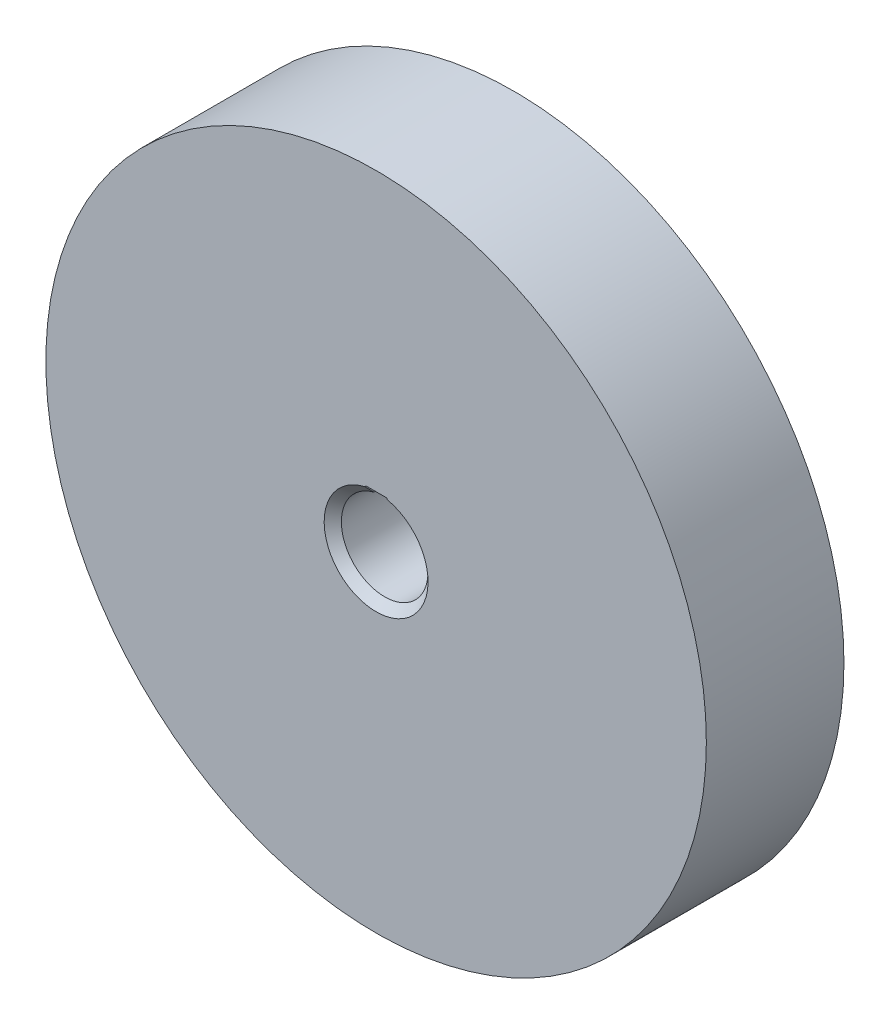
ISO-10303-21;
HEADER;
FILE_DESCRIPTION(('STEP AP214'),'2;1');
FILE_NAME('part.step','',(''),(''),'','','');
FILE_SCHEMA(('AUTOMOTIVE_DESIGN { 1 0 10303 214 1 1 1 1 }'));
ENDSEC;
DATA;
#1=APPLICATION_CONTEXT('core data for automotive mechanical design processes');
#2=APPLICATION_PROTOCOL_DEFINITION('international standard','automotive_design',2000,#1);
#3=PRODUCT_CONTEXT('',#1,'mechanical');
#4=PRODUCT('Part','Part','',(#3));
#5=PRODUCT_RELATED_PRODUCT_CATEGORY('part','',(#4));
#6=PRODUCT_DEFINITION_FORMATION('','',#4);
#7=PRODUCT_DEFINITION_CONTEXT('part definition',#1,'design');
#8=PRODUCT_DEFINITION('design','',#6,#7);
#9=PRODUCT_DEFINITION_SHAPE('','',#8);
#10=(LENGTH_UNIT() NAMED_UNIT(*) SI_UNIT(.MILLI.,.METRE.));
#11=(NAMED_UNIT(*) PLANE_ANGLE_UNIT() SI_UNIT($,.RADIAN.));
#12=(NAMED_UNIT(*) SI_UNIT($,.STERADIAN.) SOLID_ANGLE_UNIT());
#13=UNCERTAINTY_MEASURE_WITH_UNIT(LENGTH_MEASURE(1.E-05),#10,'distance_accuracy_value','');
#14=(GEOMETRIC_REPRESENTATION_CONTEXT(3) GLOBAL_UNCERTAINTY_ASSIGNED_CONTEXT((#13)) GLOBAL_UNIT_ASSIGNED_CONTEXT((#10,
#11,#12)) REPRESENTATION_CONTEXT('',''));
#15=CARTESIAN_POINT('',(0.,0.,0.));
#16=DIRECTION('',(0.,0.,1.));
#17=DIRECTION('',(1.,0.,0.));
#18=AXIS2_PLACEMENT_3D('',#15,#16,#17);
#19=CARTESIAN_POINT('',(0.,0.,6.35));
#20=DIRECTION('',(0.,0.,1.));
#21=DIRECTION('',(1.,0.,0.));
#22=AXIS2_PLACEMENT_3D('',#19,#20,#21);
#23=PLANE('',#22);
#24=DIRECTION('',(0.,-1.,0.));
#25=VECTOR('',#24,1.);
#26=CARTESIAN_POINT('',(-1.,4.8,6.35));
#27=LINE('',#26,#25);
#28=CARTESIAN_POINT('',(-1.,4.8,6.35));
#29=VERTEX_POINT('',#28);
#30=CARTESIAN_POINT('',(-1.,4.68828743386108,6.35));
#31=VERTEX_POINT('',#30);
#32=EDGE_CURVE('E130',#29,#31,#27,.T.);
#33=ORIENTED_EDGE('',*,*,#32,.F.);
#34=DIRECTION('',(1.,0.,0.));
#35=VECTOR('',#34,1.);
#36=CARTESIAN_POINT('',(-1.,4.8,6.35));
#37=LINE('',#36,#35);
#38=CARTESIAN_POINT('',(1.,4.8,6.35));
#39=VERTEX_POINT('',#38);
#40=EDGE_CURVE('E127',#29,#39,#37,.T.);
#41=ORIENTED_EDGE('',*,*,#40,.T.);
#42=DIRECTION('',(0.,-1.,0.));
#43=VECTOR('',#42,1.);
#44=CARTESIAN_POINT('',(1.,4.8,6.35));
#45=LINE('',#44,#43);
#46=CARTESIAN_POINT('',(1.,4.68828743386108,6.35));
#47=VERTEX_POINT('',#46);
#48=EDGE_CURVE('E114',#39,#47,#45,.T.);
#49=ORIENTED_EDGE('',*,*,#48,.T.);
#50=CARTESIAN_POINT('',(0.,0.,6.35));
#51=DIRECTION('',(0.,0.,1.));
#52=DIRECTION('',(1.,0.,0.));
#53=AXIS2_PLACEMENT_3D('',#50,#51,#52);
#54=CIRCLE('',#53,4.79374999999997);
#55=EDGE_CURVE('E166',#47,#31,#54,.F.);
#56=ORIENTED_EDGE('',*,*,#55,.T.);
#57=EDGE_LOOP('',(#33,#41,#49,#56));
#58=FACE_BOUND('',#57,.T.);
#59=CARTESIAN_POINT('',(0.,0.,6.35));
#60=DIRECTION('',(0.,0.,1.));
#61=DIRECTION('',(1.,0.,0.));
#62=AXIS2_PLACEMENT_3D('',#59,#60,#61);
#63=CIRCLE('',#62,30.48);
#64=CARTESIAN_POINT('',(30.48,0.,6.35));
#65=VERTEX_POINT('',#64);
#66=EDGE_CURVE('E180',#65,#65,#63,.T.);
#67=ORIENTED_EDGE('',*,*,#66,.T.);
#68=EDGE_LOOP('',(#67));
#69=FACE_BOUND('',#68,.T.);
#70=ADVANCED_FACE('F39',(#58,#69),#23,.T.);
#71=CARTESIAN_POINT('',(0.,0.,-6.35));
#72=DIRECTION('',(0.,0.,1.));
#73=DIRECTION('',(1.,0.,0.));
#74=AXIS2_PLACEMENT_3D('',#71,#72,#73);
#75=PLANE('',#74);
#76=DIRECTION('',(1.,0.,0.));
#77=VECTOR('',#76,1.);
#78=CARTESIAN_POINT('',(-1.,4.8,-6.35));
#79=LINE('',#78,#77);
#80=CARTESIAN_POINT('',(-1.,4.8,-6.35));
#81=VERTEX_POINT('',#80);
#82=CARTESIAN_POINT('',(1.,4.8,-6.35));
#83=VERTEX_POINT('',#82);
#84=EDGE_CURVE('E97',#81,#83,#79,.T.);
#85=ORIENTED_EDGE('',*,*,#84,.F.);
#86=DIRECTION('',(0.,-1.,0.));
#87=VECTOR('',#86,1.);
#88=CARTESIAN_POINT('',(-1.,4.8,-6.35));
#89=LINE('',#88,#87);
#90=CARTESIAN_POINT('',(-1.,4.6882874338611,-6.35));
#91=VERTEX_POINT('',#90);
#92=EDGE_CURVE('E124',#81,#91,#89,.T.);
#93=ORIENTED_EDGE('',*,*,#92,.T.);
#94=CARTESIAN_POINT('',(0.,0.,-6.35));
#95=DIRECTION('',(0.,0.,1.));
#96=DIRECTION('',(1.,0.,0.));
#97=AXIS2_PLACEMENT_3D('',#94,#95,#96);
#98=CIRCLE('',#97,4.79374999999999);
#99=CARTESIAN_POINT('',(1.,4.6882874338611,-6.35));
#100=VERTEX_POINT('',#99);
#101=EDGE_CURVE('E122',#91,#100,#98,.T.);
#102=ORIENTED_EDGE('',*,*,#101,.T.);
#103=DIRECTION('',(0.,-1.,0.));
#104=VECTOR('',#103,1.);
#105=CARTESIAN_POINT('',(1.,4.8,-6.35));
#106=LINE('',#105,#104);
#107=EDGE_CURVE('E109',#83,#100,#106,.T.);
#108=ORIENTED_EDGE('',*,*,#107,.F.);
#109=EDGE_LOOP('',(#85,#93,#102,#108));
#110=FACE_BOUND('',#109,.T.);
#111=CARTESIAN_POINT('',(0.,0.,-6.35));
#112=DIRECTION('',(0.,0.,1.));
#113=DIRECTION('',(1.,0.,0.));
#114=AXIS2_PLACEMENT_3D('',#111,#112,#113);
#115=CIRCLE('',#114,30.48);
#116=CARTESIAN_POINT('',(30.48,0.,-6.35));
#117=VERTEX_POINT('',#116);
#118=EDGE_CURVE('E181',#117,#117,#115,.T.);
#119=ORIENTED_EDGE('',*,*,#118,.F.);
#120=EDGE_LOOP('',(#119));
#121=FACE_BOUND('',#120,.T.);
#122=ADVANCED_FACE('F119',(#110,#121),#75,.F.);
#123=CARTESIAN_POINT('',(0.,0.,6.35));
#124=DIRECTION('',(0.,0.,-1.));
#125=DIRECTION('',(-1.,0.,0.));
#126=AXIS2_PLACEMENT_3D('',#123,#124,#125);
#127=CYLINDRICAL_SURFACE('',#126,30.48);
#128=ORIENTED_EDGE('',*,*,#66,.F.);
#129=EDGE_LOOP('',(#128));
#130=FACE_BOUND('',#129,.T.);
#131=ORIENTED_EDGE('',*,*,#118,.T.);
#132=EDGE_LOOP('',(#131));
#133=FACE_BOUND('',#132,.T.);
#134=ADVANCED_FACE('F209',(#130,#133),#127,.T.);
#135=CARTESIAN_POINT('',(0.,0.,6.35));
#136=DIRECTION('',(0.,0.,-1.));
#137=DIRECTION('',(-1.,0.,0.));
#138=AXIS2_PLACEMENT_3D('',#135,#136,#137);
#139=CYLINDRICAL_SURFACE('',#138,4.);
#140=DIRECTION('',(0.,0.,-1.));
#141=VECTOR('',#140,1.);
#142=CARTESIAN_POINT('',(-1.,3.87298334620742,6.35));
#143=LINE('',#142,#141);
#144=CARTESIAN_POINT('',(-1.,3.87298334620742,5.55625000000003));
#145=VERTEX_POINT('',#144);
#146=CARTESIAN_POINT('',(-1.,3.87298334620742,-5.55625000000001));
#147=VERTEX_POINT('',#146);
#148=EDGE_CURVE('E68',#145,#147,#143,.T.);
#149=ORIENTED_EDGE('',*,*,#148,.F.);
#150=CARTESIAN_POINT('',(0.,0.,5.55625000000003));
#151=DIRECTION('',(0.,0.,1.));
#152=DIRECTION('',(1.,0.,0.));
#153=AXIS2_PLACEMENT_3D('',#150,#151,#152);
#154=CIRCLE('',#153,4.);
#155=CARTESIAN_POINT('',(1.,3.87298334620742,5.55625000000003));
#156=VERTEX_POINT('',#155);
#157=EDGE_CURVE('E174',#145,#156,#154,.T.);
#158=ORIENTED_EDGE('',*,*,#157,.T.);
#159=DIRECTION('',(0.,0.,-1.));
#160=VECTOR('',#159,1.);
#161=CARTESIAN_POINT('',(1.,3.87298334620742,6.35));
#162=LINE('',#161,#160);
#163=CARTESIAN_POINT('',(1.,3.87298334620742,-5.55625000000001));
#164=VERTEX_POINT('',#163);
#165=EDGE_CURVE('E61',#156,#164,#162,.T.);
#166=ORIENTED_EDGE('',*,*,#165,.T.);
#167=CARTESIAN_POINT('',(0.,0.,-5.55625000000001));
#168=DIRECTION('',(0.,0.,1.));
#169=DIRECTION('',(1.,0.,0.));
#170=AXIS2_PLACEMENT_3D('',#167,#168,#169);
#171=CIRCLE('',#170,4.);
#172=EDGE_CURVE('E170',#164,#147,#171,.F.);
#173=ORIENTED_EDGE('',*,*,#172,.T.);
#174=EDGE_LOOP('',(#149,#158,#166,#173));
#175=FACE_BOUND('',#174,.T.);
#176=ADVANCED_FACE('F197',(#175),#139,.F.);
#177=CARTESIAN_POINT('',(0.,0.,-6.35));
#178=DIRECTION('',(0.,0.,-1.));
#179=DIRECTION('',(-1.,0.,0.));
#180=AXIS2_PLACEMENT_3D('',#177,#178,#179);
#181=CONICAL_SURFACE('',#180,4.79374999999999,0.785398163397447);
#182=CARTESIAN_POINT('',(-1.,1.56101887611727,-3.41010542359549));
#183=CARTESIAN_POINT('',(-1.,1.63031560156577,-3.46849195876424));
#184=CARTESIAN_POINT('',(-1.,1.69908713550226,-3.52749312653382));
#185=CARTESIAN_POINT('',(-1.,1.83578876307598,-3.64645336681735));
#186=CARTESIAN_POINT('',(-1.,1.90371891879933,-3.7064123678952));
#187=CARTESIAN_POINT('',(-1.,2.03894408112881,-3.82701417824535));
#188=CARTESIAN_POINT('',(-1.,2.10623920622223,-3.8876568551266));
#189=CARTESIAN_POINT('',(-1.,2.2403416594233,-4.00948160781827));
#190=CARTESIAN_POINT('',(-1.,2.30714897702576,-4.07066369518291));
#191=CARTESIAN_POINT('',(-1.,2.50696518711951,-4.25480177327277));
#192=CARTESIAN_POINT('',(-1.,2.63940113058987,-4.37837905441009));
#193=CARTESIAN_POINT('',(-1.,2.90328075027672,-4.6266011045816));
#194=CARTESIAN_POINT('',(-1.,3.03472436503242,-4.75124593873154));
#195=CARTESIAN_POINT('',(-1.,3.32191556784926,-5.02509769995364));
#196=CARTESIAN_POINT('',(-1.,3.477518427985,-5.17445629884279));
#197=CARTESIAN_POINT('',(-1.,3.78805778455673,-5.47386467170966));
#198=CARTESIAN_POINT('',(-1.,3.94299427863718,-5.62391444812677));
#199=CARTESIAN_POINT('',(-1.,4.4071014067997,-6.07477667561111));
#200=CARTESIAN_POINT('',(-1.,4.71557456865609,-6.37630670909211));
#201=CARTESIAN_POINT('',(-1.,5.33163911313389,-6.98053333031648));
#202=CARTESIAN_POINT('',(-1.,5.63923005052873,-7.28323037102958));
#203=CARTESIAN_POINT('',(-1.,6.10013731317609,-7.73775742388931));
#204=CARTESIAN_POINT('',(-1.,6.2536921460108,-7.88934563631695));
#205=CARTESIAN_POINT('',(-1.,6.56067138224563,-8.19265368456171));
#206=CARTESIAN_POINT('',(-1.,6.71409578581253,-8.34437352021003));
#207=CARTESIAN_POINT('',(-1.,6.86746945618316,-8.49614457640452));
#208=B_SPLINE_CURVE_WITH_KNOTS('',3,(#182,#183,#184,#185,#186,#187,#188,#189,#190,#191,#192,
#193,#194,#195,#196,#197,#198,#199,#200,#201,#202,#203,#204,#205,#206,#207),.UNSPECIFIED.,.F.,
.F.,(4,2,2,2,2,2,2,2,2,2,2,2,4),(0.,0.271832465037672,0.543644750339066,0.815405274769707,
1.0871716345484,1.63057208710798,2.17400592401157,2.82105897339018,3.46811430817453,
4.76220468121841,6.05686167325361,6.70418118342151,7.35149986470206),.UNSPECIFIED.);
#209=EDGE_CURVE('E185',#147,#91,#208,.T.);
#210=ORIENTED_EDGE('',*,*,#209,.F.);
#211=ORIENTED_EDGE('',*,*,#172,.F.);
#212=CARTESIAN_POINT('',(1.,1.56101887611726,-3.41010542359549));
#213=CARTESIAN_POINT('',(1.,1.63031560156577,-3.46849195876424));
#214=CARTESIAN_POINT('',(1.,1.69908713550225,-3.52749312653381));
#215=CARTESIAN_POINT('',(1.,1.83578876307598,-3.64645336681735));
#216=CARTESIAN_POINT('',(1.,1.90371891879932,-3.7064123678952));
#217=CARTESIAN_POINT('',(1.,2.03894408112881,-3.82701417824534));
#218=CARTESIAN_POINT('',(1.,2.10623920622223,-3.8876568551266));
#219=CARTESIAN_POINT('',(1.,2.2403416594233,-4.00948160781827));
#220=CARTESIAN_POINT('',(1.,2.30714897702575,-4.07066369518291));
#221=CARTESIAN_POINT('',(1.,2.5069651871195,-4.25480177327277));
#222=CARTESIAN_POINT('',(1.,2.63940113058986,-4.37837905441009));
#223=CARTESIAN_POINT('',(1.,2.90328075027671,-4.62660110458159));
#224=CARTESIAN_POINT('',(1.,3.03472436503241,-4.75124593873153));
#225=CARTESIAN_POINT('',(1.,3.32191556784925,-5.02509769995364));
#226=CARTESIAN_POINT('',(1.,3.47751842798499,-5.17445629884279));
#227=CARTESIAN_POINT('',(1.,3.78805778455673,-5.47386467170966));
#228=CARTESIAN_POINT('',(1.,3.94299427863717,-5.62391444812676));
#229=CARTESIAN_POINT('',(1.,4.40710140679969,-6.07477667561111));
#230=CARTESIAN_POINT('',(1.,4.71557456865608,-6.37630670909211));
#231=CARTESIAN_POINT('',(1.,5.33163911313389,-6.98053333031647));
#232=CARTESIAN_POINT('',(1.,5.63923005052872,-7.28323037102957));
#233=CARTESIAN_POINT('',(1.,6.10013731317609,-7.73775742388931));
#234=CARTESIAN_POINT('',(1.,6.25369214601079,-7.88934563631695));
#235=CARTESIAN_POINT('',(1.,6.56067138224563,-8.1926536845617));
#236=CARTESIAN_POINT('',(1.,6.71409578581253,-8.34437352021003));
#237=CARTESIAN_POINT('',(1.,6.86746945618316,-8.49614457640451));
#238=B_SPLINE_CURVE_WITH_KNOTS('',3,(#212,#213,#214,#215,#216,#217,#218,#219,#220,#221,#222,
#223,#224,#225,#226,#227,#228,#229,#230,#231,#232,#233,#234,#235,#236,#237),.UNSPECIFIED.,.F.,
.F.,(4,2,2,2,2,2,2,2,2,2,2,2,4),(0.,0.271832465037672,0.543644750339065,0.815405274769705,
1.0871716345484,1.63057208710798,2.17400592401157,2.82105897339018,3.46811430817453,
4.76220468121841,6.05686167325361,6.70418118342151,7.35149986470206),.UNSPECIFIED.);
#239=EDGE_CURVE('E141',#164,#100,#238,.T.);
#240=ORIENTED_EDGE('',*,*,#239,.T.);
#241=ORIENTED_EDGE('',*,*,#101,.F.);
#242=EDGE_LOOP('',(#210,#211,#240,#241));
#243=FACE_BOUND('',#242,.T.);
#244=ADVANCED_FACE('F150',(#243),#181,.F.);
#245=CARTESIAN_POINT('',(0.,0.,5.55625000000003));
#246=DIRECTION('',(0.,0.,1.));
#247=DIRECTION('',(1.,0.,0.));
#248=AXIS2_PLACEMENT_3D('',#245,#246,#247);
#249=CONICAL_SURFACE('',#248,4.,0.785398163397449);
#250=CARTESIAN_POINT('',(-1.,6.86746945618312,8.49614457640449));
#251=CARTESIAN_POINT('',(-1.,6.64975244621646,8.28071267299576));
#252=CARTESIAN_POINT('',(-1.,6.43194127718374,8.06537568246426));
#253=CARTESIAN_POINT('',(-1.,5.99603628756988,7.63500048278696));
#254=CARTESIAN_POINT('',(-1.,5.77794247524007,7.41996226528251));
#255=CARTESIAN_POINT('',(-1.,5.34140204805733,6.99031727878304));
#256=CARTESIAN_POINT('',(-1.,5.12295549850609,6.77571044347901));
#257=CARTESIAN_POINT('',(-1.,4.68549164636261,6.34706604570659));
#258=CARTESIAN_POINT('',(-1.,4.46647432694782,6.13302850040157));
#259=CARTESIAN_POINT('',(-1.,4.0275330027154,5.7057628364912));
#260=CARTESIAN_POINT('',(-1.,3.8076087658783,5.4925349557739));
#261=CARTESIAN_POINT('',(-1.,3.47669130053288,5.17377971066678));
#262=CARTESIAN_POINT('',(-1.,3.36621778863858,5.06771301493094));
#263=CARTESIAN_POINT('',(-1.,3.14480722777125,4.85606049036194));
#264=CARTESIAN_POINT('',(-1.,3.03387017142385,4.75047466923513));
#265=CARTESIAN_POINT('',(-1.,2.81134377523253,4.53993161704434));
#266=CARTESIAN_POINT('',(-1.,2.69975426700958,4.43497456380183));
#267=CARTESIAN_POINT('',(-1.,2.47571380933687,4.22599097209078));
#268=CARTESIAN_POINT('',(-1.,2.36326289805644,4.12196439283005));
#269=CARTESIAN_POINT('',(-1.,2.19362358732451,3.96694753618617));
#270=CARTESIAN_POINT('',(-1.,2.13690903032435,3.91543895017816));
#271=CARTESIAN_POINT('',(-1.,2.02308838260687,3.81285767396039));
#272=CARTESIAN_POINT('',(-1.,1.96598229814353,3.76178497681718));
#273=CARTESIAN_POINT('',(-1.,1.85127695419597,3.6601776576263));
#274=CARTESIAN_POINT('',(-1.,1.79367762249879,3.60964311688301));
#275=CARTESIAN_POINT('',(-1.,1.67785223852049,3.50929165435925));
#276=CARTESIAN_POINT('',(-1.,1.61962615189333,3.45947477225975));
#277=CARTESIAN_POINT('',(-1.,1.56101887611729,3.41010542359554));
#278=B_SPLINE_CURVE_WITH_KNOTS('',3,(#250,#251,#252,#253,#254,#255,#256,#257,#258,#259,#260,
#261,#262,#263,#264,#265,#266,#267,#268,#269,#270,#271,#272,#273,#274,#275,#276,#277),
.UNSPECIFIED.,.F.,.F.,(4,2,2,2,2,2,2,2,2,2,2,2,2,4),(0.,0.918860610612807,1.83769497504105,
2.75637524406617,3.67508290308531,4.59404232374607,5.05348758126209,5.51294017596933,
5.97251709422262,6.43207376478724,6.66191342521397,6.89174942286517,7.12161966496871,
7.35150256870863),.UNSPECIFIED.);
#279=EDGE_CURVE('E11',#31,#145,#278,.T.);
#280=ORIENTED_EDGE('',*,*,#279,.F.);
#281=ORIENTED_EDGE('',*,*,#55,.F.);
#282=CARTESIAN_POINT('',(1.,6.86746945618312,8.49614457640449));
#283=CARTESIAN_POINT('',(1.,6.64975244621646,8.28071267299576));
#284=CARTESIAN_POINT('',(1.,6.43194127718374,8.06537568246426));
#285=CARTESIAN_POINT('',(1.,5.99603628756988,7.63500048278696));
#286=CARTESIAN_POINT('',(1.,5.77794247524007,7.41996226528251));
#287=CARTESIAN_POINT('',(1.,5.34140204805733,6.99031727878304));
#288=CARTESIAN_POINT('',(1.,5.12295549850609,6.77571044347901));
#289=CARTESIAN_POINT('',(1.,4.68549164636261,6.34706604570659));
#290=CARTESIAN_POINT('',(1.,4.46647432694782,6.13302850040157));
#291=CARTESIAN_POINT('',(1.,4.02753300271539,5.7057628364912));
#292=CARTESIAN_POINT('',(1.,3.8076087658783,5.4925349557739));
#293=CARTESIAN_POINT('',(1.,3.47669130053288,5.17377971066678));
#294=CARTESIAN_POINT('',(1.,3.36621778863858,5.06771301493093));
#295=CARTESIAN_POINT('',(1.,3.14480722777125,4.85606049036194));
#296=CARTESIAN_POINT('',(1.,3.03387017142385,4.75047466923513));
#297=CARTESIAN_POINT('',(1.,2.81134377523253,4.53993161704434));
#298=CARTESIAN_POINT('',(1.,2.69975426700957,4.43497456380183));
#299=CARTESIAN_POINT('',(1.,2.47571380933687,4.22599097209078));
#300=CARTESIAN_POINT('',(1.,2.36326289805644,4.12196439283005));
#301=CARTESIAN_POINT('',(1.,2.1936235873245,3.96694753618617));
#302=CARTESIAN_POINT('',(1.,2.13690903032434,3.91543895017816));
#303=CARTESIAN_POINT('',(1.,2.02308838260687,3.81285767396039));
#304=CARTESIAN_POINT('',(1.,1.96598229814353,3.76178497681717));
#305=CARTESIAN_POINT('',(1.,1.85127695419597,3.6601776576263));
#306=CARTESIAN_POINT('',(1.,1.79367762249878,3.60964311688301));
#307=CARTESIAN_POINT('',(1.,1.67785223852049,3.50929165435925));
#308=CARTESIAN_POINT('',(1.,1.61962615189332,3.45947477225974));
#309=CARTESIAN_POINT('',(1.,1.56101887611729,3.41010542359554));
#310=B_SPLINE_CURVE_WITH_KNOTS('',3,(#282,#283,#284,#285,#286,#287,#288,#289,#290,#291,#292,
#293,#294,#295,#296,#297,#298,#299,#300,#301,#302,#303,#304,#305,#306,#307,#308,#309),
.UNSPECIFIED.,.F.,.F.,(4,2,2,2,2,2,2,2,2,2,2,2,2,4),(0.,0.918860610612807,1.83769497504105,
2.75637524406617,3.67508290308531,4.59404232374607,5.05348758126209,5.51294017596933,
5.97251709422262,6.43207376478724,6.66191342521397,6.89174942286517,7.12161966496871,
7.35150256870863),.UNSPECIFIED.);
#311=EDGE_CURVE('E54',#47,#156,#310,.T.);
#312=ORIENTED_EDGE('',*,*,#311,.T.);
#313=ORIENTED_EDGE('',*,*,#157,.F.);
#314=EDGE_LOOP('',(#280,#281,#312,#313));
#315=FACE_BOUND('',#314,.T.);
#316=ADVANCED_FACE('F41',(#315),#249,.F.);
#317=CARTESIAN_POINT('',(-1.,4.8,-6.35));
#318=DIRECTION('',(-1.,0.,0.));
#319=DIRECTION('',(0.,0.,1.));
#320=AXIS2_PLACEMENT_3D('',#317,#318,#319);
#321=PLANE('',#320);
#322=ORIENTED_EDGE('',*,*,#209,.T.);
#323=ORIENTED_EDGE('',*,*,#92,.F.);
#324=DIRECTION('',(0.,0.,1.));
#325=VECTOR('',#324,1.);
#326=CARTESIAN_POINT('',(-1.,4.8,-6.35));
#327=LINE('',#326,#325);
#328=EDGE_CURVE('E103',#81,#29,#327,.T.);
#329=ORIENTED_EDGE('',*,*,#328,.T.);
#330=ORIENTED_EDGE('',*,*,#32,.T.);
#331=ORIENTED_EDGE('',*,*,#279,.T.);
#332=ORIENTED_EDGE('',*,*,#148,.T.);
#333=EDGE_LOOP('',(#322,#323,#329,#330,#331,#332));
#334=FACE_BOUND('',#333,.T.);
#335=ADVANCED_FACE('F156',(#334),#321,.F.);
#336=CARTESIAN_POINT('',(-1.,4.8,-6.35));
#337=DIRECTION('',(0.,-1.,0.));
#338=DIRECTION('',(0.,0.,-1.));
#339=AXIS2_PLACEMENT_3D('',#336,#337,#338);
#340=PLANE('',#339);
#341=ORIENTED_EDGE('',*,*,#40,.F.);
#342=ORIENTED_EDGE('',*,*,#328,.F.);
#343=ORIENTED_EDGE('',*,*,#84,.T.);
#344=DIRECTION('',(0.,0.,1.));
#345=VECTOR('',#344,1.);
#346=CARTESIAN_POINT('',(1.,4.8,-6.35));
#347=LINE('',#346,#345);
#348=EDGE_CURVE('E101',#83,#39,#347,.T.);
#349=ORIENTED_EDGE('',*,*,#348,.T.);
#350=EDGE_LOOP('',(#341,#342,#343,#349));
#351=FACE_BOUND('',#350,.T.);
#352=ADVANCED_FACE('F100',(#351),#340,.T.);
#353=CARTESIAN_POINT('',(1.,4.8,-6.35));
#354=DIRECTION('',(-1.,0.,0.));
#355=DIRECTION('',(0.,0.,1.));
#356=AXIS2_PLACEMENT_3D('',#353,#354,#355);
#357=PLANE('',#356);
#358=ORIENTED_EDGE('',*,*,#165,.F.);
#359=ORIENTED_EDGE('',*,*,#311,.F.);
#360=ORIENTED_EDGE('',*,*,#48,.F.);
#361=ORIENTED_EDGE('',*,*,#348,.F.);
#362=ORIENTED_EDGE('',*,*,#107,.T.);
#363=ORIENTED_EDGE('',*,*,#239,.F.);
#364=EDGE_LOOP('',(#358,#359,#360,#361,#362,#363));
#365=FACE_BOUND('',#364,.T.);
#366=ADVANCED_FACE('F111',(#365),#357,.T.);
#367=CLOSED_SHELL('',(#70,#122,#134,#176,#244,#316,#335,#352,#366));
#368=MANIFOLD_SOLID_BREP('B2',#367);
#369=ADVANCED_BREP_SHAPE_REPRESENTATION('',(#18,#368),#14);
#370=SHAPE_DEFINITION_REPRESENTATION(#9,#369);
ENDSEC;
END-ISO-10303-21;
